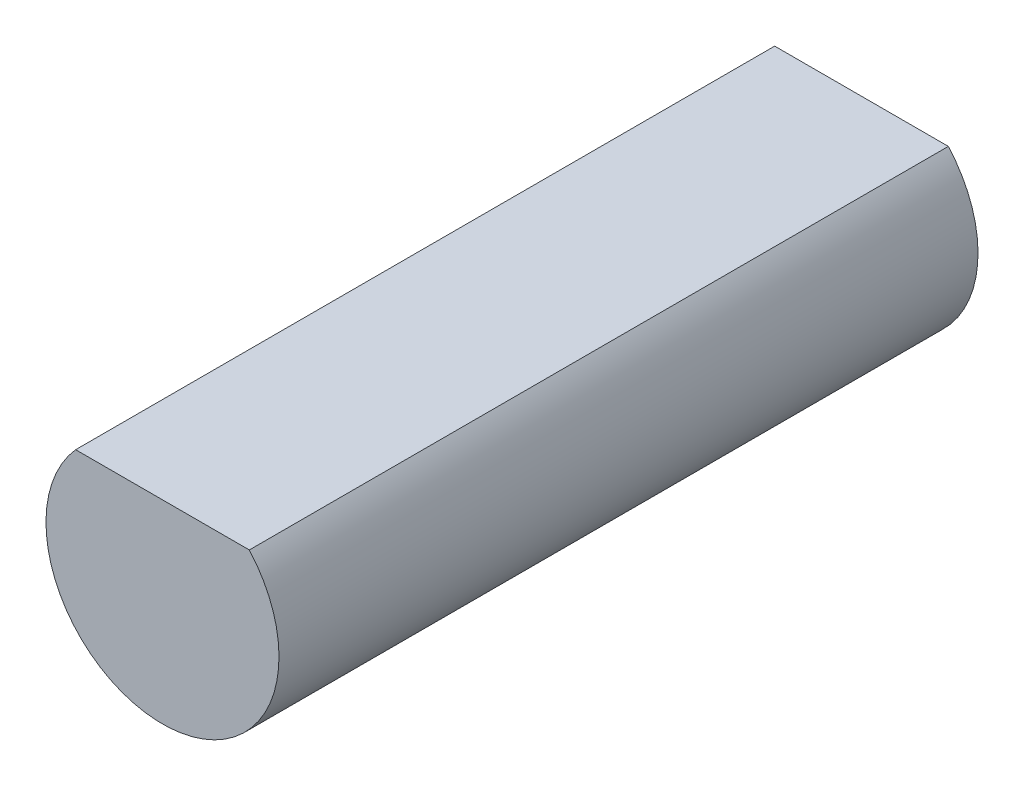
ISO-10303-21;
HEADER;
FILE_DESCRIPTION(('STEP AP214'),'2;1');
FILE_NAME('part.step','',(''),(''),'','','');
FILE_SCHEMA(('AUTOMOTIVE_DESIGN { 1 0 10303 214 1 1 1 1 }'));
ENDSEC;
DATA;
#1=APPLICATION_CONTEXT('core data for automotive mechanical design processes');
#2=APPLICATION_PROTOCOL_DEFINITION('international standard','automotive_design',2000,#1);
#3=PRODUCT_CONTEXT('',#1,'mechanical');
#4=PRODUCT('Part','Part','',(#3));
#5=PRODUCT_RELATED_PRODUCT_CATEGORY('part','',(#4));
#6=PRODUCT_DEFINITION_FORMATION('','',#4);
#7=PRODUCT_DEFINITION_CONTEXT('part definition',#1,'design');
#8=PRODUCT_DEFINITION('design','',#6,#7);
#9=PRODUCT_DEFINITION_SHAPE('','',#8);
#10=(LENGTH_UNIT() NAMED_UNIT(*) SI_UNIT(.MILLI.,.METRE.));
#11=(NAMED_UNIT(*) PLANE_ANGLE_UNIT() SI_UNIT($,.RADIAN.));
#12=(NAMED_UNIT(*) SI_UNIT($,.STERADIAN.) SOLID_ANGLE_UNIT());
#13=UNCERTAINTY_MEASURE_WITH_UNIT(LENGTH_MEASURE(1.E-05),#10,'distance_accuracy_value','');
#14=(GEOMETRIC_REPRESENTATION_CONTEXT(3) GLOBAL_UNCERTAINTY_ASSIGNED_CONTEXT((#13)) GLOBAL_UNIT_ASSIGNED_CONTEXT((#10,
#11,#12)) REPRESENTATION_CONTEXT('',''));
#15=CARTESIAN_POINT('',(0.,0.,0.));
#16=DIRECTION('',(0.,0.,1.));
#17=DIRECTION('',(1.,0.,0.));
#18=AXIS2_PLACEMENT_3D('',#15,#16,#17);
#19=CARTESIAN_POINT('',(0.,0.,9.));
#20=DIRECTION('',(0.,0.,-1.));
#21=DIRECTION('',(-1.,0.,0.));
#22=AXIS2_PLACEMENT_3D('',#19,#20,#21);
#23=CYLINDRICAL_SURFACE('',#22,1.5);
#24=CARTESIAN_POINT('',(0.,0.,0.));
#25=DIRECTION('',(0.,0.,1.));
#26=DIRECTION('',(1.,0.,0.));
#27=AXIS2_PLACEMENT_3D('',#24,#25,#26);
#28=CIRCLE('',#27,1.5);
#29=CARTESIAN_POINT('',(-1.11803398874989,1.,0.));
#30=VERTEX_POINT('',#29);
#31=CARTESIAN_POINT('',(1.11803398874989,1.,0.));
#32=VERTEX_POINT('',#31);
#33=EDGE_CURVE('E63',#30,#32,#28,.T.);
#34=ORIENTED_EDGE('',*,*,#33,.T.);
#35=DIRECTION('',(0.,0.,-1.));
#36=VECTOR('',#35,1.);
#37=CARTESIAN_POINT('',(1.11803398874989,1.,9.));
#38=LINE('',#37,#36);
#39=CARTESIAN_POINT('',(1.11803398874989,1.,9.));
#40=VERTEX_POINT('',#39);
#41=EDGE_CURVE('E11',#40,#32,#38,.T.);
#42=ORIENTED_EDGE('',*,*,#41,.F.);
#43=CARTESIAN_POINT('',(0.,0.,9.));
#44=DIRECTION('',(0.,0.,1.));
#45=DIRECTION('',(1.,0.,0.));
#46=AXIS2_PLACEMENT_3D('',#43,#44,#45);
#47=CIRCLE('',#46,1.5);
#48=CARTESIAN_POINT('',(-1.11803398874989,1.,9.));
#49=VERTEX_POINT('',#48);
#50=EDGE_CURVE('E62',#49,#40,#47,.T.);
#51=ORIENTED_EDGE('',*,*,#50,.F.);
#52=DIRECTION('',(0.,0.,-1.));
#53=VECTOR('',#52,1.);
#54=CARTESIAN_POINT('',(-1.11803398874989,1.,9.));
#55=LINE('',#54,#53);
#56=EDGE_CURVE('E40',#49,#30,#55,.T.);
#57=ORIENTED_EDGE('',*,*,#56,.T.);
#58=EDGE_LOOP('',(#34,#42,#51,#57));
#59=FACE_BOUND('',#58,.T.);
#60=ADVANCED_FACE('F32',(#59),#23,.T.);
#61=CARTESIAN_POINT('',(-1.11803398874989,1.,9.));
#62=DIRECTION('',(0.,-1.,0.));
#63=DIRECTION('',(0.,0.,-1.));
#64=AXIS2_PLACEMENT_3D('',#61,#62,#63);
#65=PLANE('',#64);
#66=DIRECTION('',(-1.,0.,0.));
#67=VECTOR('',#66,1.);
#68=CARTESIAN_POINT('',(-1.11803398874989,1.,0.));
#69=LINE('',#68,#67);
#70=EDGE_CURVE('E55',#32,#30,#69,.T.);
#71=ORIENTED_EDGE('',*,*,#70,.T.);
#72=ORIENTED_EDGE('',*,*,#56,.F.);
#73=DIRECTION('',(-1.,0.,0.));
#74=VECTOR('',#73,1.);
#75=CARTESIAN_POINT('',(-1.11803398874989,1.,9.));
#76=LINE('',#75,#74);
#77=EDGE_CURVE('E47',#40,#49,#76,.T.);
#78=ORIENTED_EDGE('',*,*,#77,.F.);
#79=ORIENTED_EDGE('',*,*,#41,.T.);
#80=EDGE_LOOP('',(#71,#72,#78,#79));
#81=FACE_BOUND('',#80,.T.);
#82=ADVANCED_FACE('F58',(#81),#65,.F.);
#83=CARTESIAN_POINT('',(0.,0.,9.));
#84=DIRECTION('',(0.,0.,1.));
#85=DIRECTION('',(1.,0.,0.));
#86=AXIS2_PLACEMENT_3D('',#83,#84,#85);
#87=PLANE('',#86);
#88=ORIENTED_EDGE('',*,*,#50,.T.);
#89=ORIENTED_EDGE('',*,*,#77,.T.);
#90=EDGE_LOOP('',(#88,#89));
#91=FACE_BOUND('',#90,.T.);
#92=ADVANCED_FACE('F70',(#91),#87,.T.);
#93=CARTESIAN_POINT('',(0.,0.,0.));
#94=DIRECTION('',(0.,0.,1.));
#95=DIRECTION('',(1.,0.,0.));
#96=AXIS2_PLACEMENT_3D('',#93,#94,#95);
#97=PLANE('',#96);
#98=ORIENTED_EDGE('',*,*,#33,.F.);
#99=ORIENTED_EDGE('',*,*,#70,.F.);
#100=EDGE_LOOP('',(#98,#99));
#101=FACE_BOUND('',#100,.T.);
#102=ADVANCED_FACE('F66',(#101),#97,.F.);
#103=CLOSED_SHELL('',(#60,#82,#92,#102));
#104=MANIFOLD_SOLID_BREP('B2',#103);
#105=ADVANCED_BREP_SHAPE_REPRESENTATION('',(#18,#104),#14);
#106=SHAPE_DEFINITION_REPRESENTATION(#9,#105);
ENDSEC;
END-ISO-10303-21;
